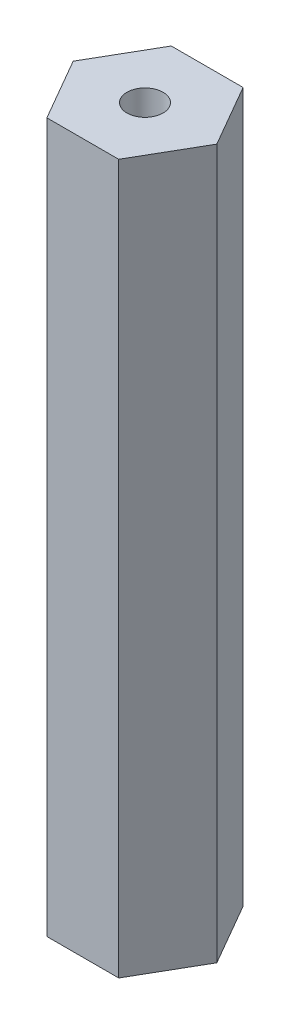
ISO-10303-21;
HEADER;
FILE_DESCRIPTION(('STEP AP214'),'2;1');
FILE_NAME('part.step','',(''),(''),'','','');
FILE_SCHEMA(('AUTOMOTIVE_DESIGN { 1 0 10303 214 1 1 1 1 }'));
ENDSEC;
DATA;
#1=APPLICATION_CONTEXT('core data for automotive mechanical design processes');
#2=APPLICATION_PROTOCOL_DEFINITION('international standard','automotive_design',2000,#1);
#3=PRODUCT_CONTEXT('',#1,'mechanical');
#4=PRODUCT('Part','Part','',(#3));
#5=PRODUCT_RELATED_PRODUCT_CATEGORY('part','',(#4));
#6=PRODUCT_DEFINITION_FORMATION('','',#4);
#7=PRODUCT_DEFINITION_CONTEXT('part definition',#1,'design');
#8=PRODUCT_DEFINITION('design','',#6,#7);
#9=PRODUCT_DEFINITION_SHAPE('','',#8);
#10=(LENGTH_UNIT() NAMED_UNIT(*) SI_UNIT(.MILLI.,.METRE.));
#11=(NAMED_UNIT(*) PLANE_ANGLE_UNIT() SI_UNIT($,.RADIAN.));
#12=(NAMED_UNIT(*) SI_UNIT($,.STERADIAN.) SOLID_ANGLE_UNIT());
#13=UNCERTAINTY_MEASURE_WITH_UNIT(LENGTH_MEASURE(1.E-05),#10,'distance_accuracy_value','');
#14=(GEOMETRIC_REPRESENTATION_CONTEXT(3) GLOBAL_UNCERTAINTY_ASSIGNED_CONTEXT((#13)) GLOBAL_UNIT_ASSIGNED_CONTEXT((#10,
#11,#12)) REPRESENTATION_CONTEXT('',''));
#15=CARTESIAN_POINT('',(0.,0.,0.));
#16=DIRECTION('',(0.,0.,1.));
#17=DIRECTION('',(1.,0.,0.));
#18=AXIS2_PLACEMENT_3D('',#15,#16,#17);
#19=CARTESIAN_POINT('',(0.,57.,0.));
#20=DIRECTION('',(0.,1.,0.));
#21=DIRECTION('',(0.,0.,1.));
#22=AXIS2_PLACEMENT_3D('',#19,#20,#21);
#23=PLANE('',#22);
#24=DIRECTION('',(0.5,0.,-0.866025403784439));
#25=VECTOR('',#24,1.);
#26=CARTESIAN_POINT('',(2.88675134594813,57.,5.));
#27=LINE('',#26,#25);
#28=CARTESIAN_POINT('',(2.88675134594813,57.,5.));
#29=VERTEX_POINT('',#28);
#30=CARTESIAN_POINT('',(5.77350269189626,57.,0.));
#31=VERTEX_POINT('',#30);
#32=EDGE_CURVE('E131',#29,#31,#27,.T.);
#33=ORIENTED_EDGE('',*,*,#32,.T.);
#34=DIRECTION('',(-0.500000000000001,0.,-0.866025403784438));
#35=VECTOR('',#34,1.);
#36=CARTESIAN_POINT('',(5.77350269189626,57.,0.));
#37=LINE('',#36,#35);
#38=CARTESIAN_POINT('',(2.88675134594813,57.,-5.));
#39=VERTEX_POINT('',#38);
#40=EDGE_CURVE('E89',#31,#39,#37,.T.);
#41=ORIENTED_EDGE('',*,*,#40,.T.);
#42=DIRECTION('',(-1.,0.,0.));
#43=VECTOR('',#42,1.);
#44=CARTESIAN_POINT('',(2.88675134594813,57.,-5.));
#45=LINE('',#44,#43);
#46=CARTESIAN_POINT('',(-2.88675134594813,57.,-5.));
#47=VERTEX_POINT('',#46);
#48=EDGE_CURVE('E102',#39,#47,#45,.T.);
#49=ORIENTED_EDGE('',*,*,#48,.T.);
#50=DIRECTION('',(-0.5,0.,0.866025403784439));
#51=VECTOR('',#50,1.);
#52=CARTESIAN_POINT('',(-2.88675134594813,57.,-5.));
#53=LINE('',#52,#51);
#54=CARTESIAN_POINT('',(-5.77350269189626,57.,0.));
#55=VERTEX_POINT('',#54);
#56=EDGE_CURVE('E96',#47,#55,#53,.T.);
#57=ORIENTED_EDGE('',*,*,#56,.T.);
#58=DIRECTION('',(0.5,0.,0.866025403784439));
#59=VECTOR('',#58,1.);
#60=CARTESIAN_POINT('',(-5.77350269189626,57.,0.));
#61=LINE('',#60,#59);
#62=CARTESIAN_POINT('',(-2.88675134594813,57.,5.));
#63=VERTEX_POINT('',#62);
#64=EDGE_CURVE('E100',#55,#63,#61,.T.);
#65=ORIENTED_EDGE('',*,*,#64,.T.);
#66=DIRECTION('',(1.,0.,0.));
#67=VECTOR('',#66,1.);
#68=CARTESIAN_POINT('',(-2.88675134594813,57.,5.));
#69=LINE('',#68,#67);
#70=EDGE_CURVE('E52',#63,#29,#69,.T.);
#71=ORIENTED_EDGE('',*,*,#70,.T.);
#72=EDGE_LOOP('',(#33,#41,#49,#57,#65,#71));
#73=FACE_BOUND('',#72,.T.);
#74=CARTESIAN_POINT('',(0.,57.,0.));
#75=DIRECTION('',(0.,1.,0.));
#76=DIRECTION('',(0.,0.,1.));
#77=AXIS2_PLACEMENT_3D('',#74,#75,#76);
#78=CIRCLE('',#77,1.45);
#79=CARTESIAN_POINT('',(0.,57.,-1.45));
#80=VERTEX_POINT('',#79);
#81=EDGE_CURVE('E124',#80,#80,#78,.T.);
#82=ORIENTED_EDGE('',*,*,#81,.F.);
#83=EDGE_LOOP('',(#82));
#84=FACE_BOUND('',#83,.T.);
#85=ADVANCED_FACE('F35',(#73,#84),#23,.T.);
#86=CARTESIAN_POINT('',(0.,0.,0.));
#87=DIRECTION('',(0.,1.,0.));
#88=DIRECTION('',(0.,0.,1.));
#89=AXIS2_PLACEMENT_3D('',#86,#87,#88);
#90=PLANE('',#89);
#91=DIRECTION('',(0.5,0.,-0.866025403784439));
#92=VECTOR('',#91,1.);
#93=CARTESIAN_POINT('',(2.88675134594813,0.,5.));
#94=LINE('',#93,#92);
#95=CARTESIAN_POINT('',(2.88675134594813,0.,5.));
#96=VERTEX_POINT('',#95);
#97=CARTESIAN_POINT('',(5.77350269189626,0.,0.));
#98=VERTEX_POINT('',#97);
#99=EDGE_CURVE('E120',#96,#98,#94,.T.);
#100=ORIENTED_EDGE('',*,*,#99,.F.);
#101=DIRECTION('',(1.,0.,0.));
#102=VECTOR('',#101,1.);
#103=CARTESIAN_POINT('',(-2.88675134594813,0.,5.));
#104=LINE('',#103,#102);
#105=CARTESIAN_POINT('',(-2.88675134594813,0.,5.));
#106=VERTEX_POINT('',#105);
#107=EDGE_CURVE('E81',#106,#96,#104,.T.);
#108=ORIENTED_EDGE('',*,*,#107,.F.);
#109=DIRECTION('',(0.5,0.,0.866025403784439));
#110=VECTOR('',#109,1.);
#111=CARTESIAN_POINT('',(-5.77350269189626,0.,0.));
#112=LINE('',#111,#110);
#113=CARTESIAN_POINT('',(-5.77350269189626,0.,0.));
#114=VERTEX_POINT('',#113);
#115=EDGE_CURVE('E75',#114,#106,#112,.T.);
#116=ORIENTED_EDGE('',*,*,#115,.F.);
#117=DIRECTION('',(-0.5,0.,0.866025403784439));
#118=VECTOR('',#117,1.);
#119=CARTESIAN_POINT('',(-2.88675134594813,0.,-5.));
#120=LINE('',#119,#118);
#121=CARTESIAN_POINT('',(-2.88675134594813,0.,-5.));
#122=VERTEX_POINT('',#121);
#123=EDGE_CURVE('E110',#122,#114,#120,.T.);
#124=ORIENTED_EDGE('',*,*,#123,.F.);
#125=DIRECTION('',(-1.,0.,0.));
#126=VECTOR('',#125,1.);
#127=CARTESIAN_POINT('',(2.88675134594813,0.,-5.));
#128=LINE('',#127,#126);
#129=CARTESIAN_POINT('',(2.88675134594813,0.,-5.));
#130=VERTEX_POINT('',#129);
#131=EDGE_CURVE('E126',#130,#122,#128,.T.);
#132=ORIENTED_EDGE('',*,*,#131,.F.);
#133=DIRECTION('',(-0.500000000000001,0.,-0.866025403784438));
#134=VECTOR('',#133,1.);
#135=CARTESIAN_POINT('',(5.77350269189626,0.,0.));
#136=LINE('',#135,#134);
#137=EDGE_CURVE('E123',#98,#130,#136,.T.);
#138=ORIENTED_EDGE('',*,*,#137,.F.);
#139=EDGE_LOOP('',(#100,#108,#116,#124,#132,#138));
#140=FACE_BOUND('',#139,.T.);
#141=CARTESIAN_POINT('',(0.,0.,0.));
#142=DIRECTION('',(0.,1.,0.));
#143=DIRECTION('',(0.,0.,1.));
#144=AXIS2_PLACEMENT_3D('',#141,#142,#143);
#145=CIRCLE('',#144,1.45);
#146=CARTESIAN_POINT('',(0.,0.,-1.45));
#147=VERTEX_POINT('',#146);
#148=EDGE_CURVE('E224',#147,#147,#145,.T.);
#149=ORIENTED_EDGE('',*,*,#148,.T.);
#150=EDGE_LOOP('',(#149));
#151=FACE_BOUND('',#150,.T.);
#152=ADVANCED_FACE('F140',(#140,#151),#90,.F.);
#153=CARTESIAN_POINT('',(2.88675134594813,57.,5.));
#154=DIRECTION('',(-0.866025403784439,0.,-0.5));
#155=DIRECTION('',(-0.5,0.,0.866025403784439));
#156=AXIS2_PLACEMENT_3D('',#153,#154,#155);
#157=PLANE('',#156);
#158=ORIENTED_EDGE('',*,*,#99,.T.);
#159=DIRECTION('',(0.,-1.,0.));
#160=VECTOR('',#159,1.);
#161=CARTESIAN_POINT('',(5.77350269189626,57.,0.));
#162=LINE('',#161,#160);
#163=EDGE_CURVE('E11',#31,#98,#162,.T.);
#164=ORIENTED_EDGE('',*,*,#163,.F.);
#165=ORIENTED_EDGE('',*,*,#32,.F.);
#166=DIRECTION('',(0.,-1.,0.));
#167=VECTOR('',#166,1.);
#168=CARTESIAN_POINT('',(2.88675134594813,57.,5.));
#169=LINE('',#168,#167);
#170=EDGE_CURVE('E116',#29,#96,#169,.T.);
#171=ORIENTED_EDGE('',*,*,#170,.T.);
#172=EDGE_LOOP('',(#158,#164,#165,#171));
#173=FACE_BOUND('',#172,.T.);
#174=ADVANCED_FACE('F37',(#173),#157,.F.);
#175=CARTESIAN_POINT('',(5.77350269189626,57.,0.));
#176=DIRECTION('',(-0.866025403784438,0.,0.5));
#177=DIRECTION('',(0.500000000000001,0.,0.866025403784438));
#178=AXIS2_PLACEMENT_3D('',#175,#176,#177);
#179=PLANE('',#178);
#180=ORIENTED_EDGE('',*,*,#137,.T.);
#181=DIRECTION('',(0.,-1.,0.));
#182=VECTOR('',#181,1.);
#183=CARTESIAN_POINT('',(2.88675134594813,57.,-5.));
#184=LINE('',#183,#182);
#185=EDGE_CURVE('E44',#39,#130,#184,.T.);
#186=ORIENTED_EDGE('',*,*,#185,.F.);
#187=ORIENTED_EDGE('',*,*,#40,.F.);
#188=ORIENTED_EDGE('',*,*,#163,.T.);
#189=EDGE_LOOP('',(#180,#186,#187,#188));
#190=FACE_BOUND('',#189,.T.);
#191=ADVANCED_FACE('F165',(#190),#179,.F.);
#192=CARTESIAN_POINT('',(2.88675134594813,57.,-5.));
#193=DIRECTION('',(0.,0.,1.));
#194=DIRECTION('',(1.,0.,0.));
#195=AXIS2_PLACEMENT_3D('',#192,#193,#194);
#196=PLANE('',#195);
#197=ORIENTED_EDGE('',*,*,#131,.T.);
#198=DIRECTION('',(0.,-1.,0.));
#199=VECTOR('',#198,1.);
#200=CARTESIAN_POINT('',(-2.88675134594813,57.,-5.));
#201=LINE('',#200,#199);
#202=EDGE_CURVE('E111',#47,#122,#201,.T.);
#203=ORIENTED_EDGE('',*,*,#202,.F.);
#204=ORIENTED_EDGE('',*,*,#48,.F.);
#205=ORIENTED_EDGE('',*,*,#185,.T.);
#206=EDGE_LOOP('',(#197,#203,#204,#205));
#207=FACE_BOUND('',#206,.T.);
#208=ADVANCED_FACE('F137',(#207),#196,.F.);
#209=CARTESIAN_POINT('',(-2.88675134594813,57.,-5.));
#210=DIRECTION('',(0.866025403784439,0.,0.5));
#211=DIRECTION('',(0.5,0.,-0.866025403784439));
#212=AXIS2_PLACEMENT_3D('',#209,#210,#211);
#213=PLANE('',#212);
#214=ORIENTED_EDGE('',*,*,#123,.T.);
#215=DIRECTION('',(0.,-1.,0.));
#216=VECTOR('',#215,1.);
#217=CARTESIAN_POINT('',(-5.77350269189626,57.,0.));
#218=LINE('',#217,#216);
#219=EDGE_CURVE('E107',#55,#114,#218,.T.);
#220=ORIENTED_EDGE('',*,*,#219,.F.);
#221=ORIENTED_EDGE('',*,*,#56,.F.);
#222=ORIENTED_EDGE('',*,*,#202,.T.);
#223=EDGE_LOOP('',(#214,#220,#221,#222));
#224=FACE_BOUND('',#223,.T.);
#225=ADVANCED_FACE('F108',(#224),#213,.F.);
#226=CARTESIAN_POINT('',(-5.77350269189626,57.,0.));
#227=DIRECTION('',(0.866025403784439,0.,-0.5));
#228=DIRECTION('',(-0.5,0.,-0.866025403784439));
#229=AXIS2_PLACEMENT_3D('',#226,#227,#228);
#230=PLANE('',#229);
#231=ORIENTED_EDGE('',*,*,#115,.T.);
#232=DIRECTION('',(0.,-1.,0.));
#233=VECTOR('',#232,1.);
#234=CARTESIAN_POINT('',(-2.88675134594813,57.,5.));
#235=LINE('',#234,#233);
#236=EDGE_CURVE('E112',#63,#106,#235,.T.);
#237=ORIENTED_EDGE('',*,*,#236,.F.);
#238=ORIENTED_EDGE('',*,*,#64,.F.);
#239=ORIENTED_EDGE('',*,*,#219,.T.);
#240=EDGE_LOOP('',(#231,#237,#238,#239));
#241=FACE_BOUND('',#240,.T.);
#242=ADVANCED_FACE('F114',(#241),#230,.F.);
#243=CARTESIAN_POINT('',(-2.88675134594813,57.,5.));
#244=DIRECTION('',(0.,0.,-1.));
#245=DIRECTION('',(-1.,0.,0.));
#246=AXIS2_PLACEMENT_3D('',#243,#244,#245);
#247=PLANE('',#246);
#248=ORIENTED_EDGE('',*,*,#107,.T.);
#249=ORIENTED_EDGE('',*,*,#170,.F.);
#250=ORIENTED_EDGE('',*,*,#70,.F.);
#251=ORIENTED_EDGE('',*,*,#236,.T.);
#252=EDGE_LOOP('',(#248,#249,#250,#251));
#253=FACE_BOUND('',#252,.T.);
#254=ADVANCED_FACE('F145',(#253),#247,.F.);
#255=CARTESIAN_POINT('',(0.,57.,0.));
#256=DIRECTION('',(0.,-1.,0.));
#257=DIRECTION('',(0.,0.,-1.));
#258=AXIS2_PLACEMENT_3D('',#255,#256,#257);
#259=CYLINDRICAL_SURFACE('',#258,1.45);
#260=CARTESIAN_POINT('',(0.,57.,-1.45));
#261=CARTESIAN_POINT('',(0.,56.40625,-1.45));
#262=CARTESIAN_POINT('',(0.,55.8125,-1.45));
#263=CARTESIAN_POINT('',(0.,54.625,-1.45));
#264=CARTESIAN_POINT('',(0.,54.03125,-1.45));
#265=CARTESIAN_POINT('',(0.,52.84375,-1.45));
#266=CARTESIAN_POINT('',(0.,52.25,-1.45));
#267=CARTESIAN_POINT('',(0.,51.0625,-1.45));
#268=CARTESIAN_POINT('',(0.,50.46875,-1.45));
#269=CARTESIAN_POINT('',(0.,49.28125,-1.45));
#270=CARTESIAN_POINT('',(0.,48.6875,-1.45));
#271=CARTESIAN_POINT('',(0.,47.5,-1.45));
#272=CARTESIAN_POINT('',(0.,46.90625,-1.45));
#273=CARTESIAN_POINT('',(0.,45.71875,-1.45));
#274=CARTESIAN_POINT('',(0.,45.125,-1.45));
#275=CARTESIAN_POINT('',(0.,43.9375,-1.45));
#276=CARTESIAN_POINT('',(0.,43.34375,-1.45));
#277=CARTESIAN_POINT('',(0.,42.15625,-1.45));
#278=CARTESIAN_POINT('',(0.,41.5625,-1.45));
#279=CARTESIAN_POINT('',(0.,40.375,-1.45));
#280=CARTESIAN_POINT('',(0.,39.78125,-1.45));
#281=CARTESIAN_POINT('',(0.,38.59375,-1.45));
#282=CARTESIAN_POINT('',(0.,38.,-1.45));
#283=CARTESIAN_POINT('',(0.,36.8125,-1.45));
#284=CARTESIAN_POINT('',(0.,36.21875,-1.45));
#285=CARTESIAN_POINT('',(0.,35.03125,-1.45));
#286=CARTESIAN_POINT('',(0.,34.4375,-1.45));
#287=CARTESIAN_POINT('',(0.,33.25,-1.45));
#288=CARTESIAN_POINT('',(0.,32.65625,-1.45));
#289=CARTESIAN_POINT('',(0.,31.46875,-1.45));
#290=CARTESIAN_POINT('',(0.,30.875,-1.45));
#291=CARTESIAN_POINT('',(0.,29.6875,-1.45));
#292=CARTESIAN_POINT('',(0.,29.09375,-1.45));
#293=CARTESIAN_POINT('',(0.,27.90625,-1.45));
#294=CARTESIAN_POINT('',(0.,27.3125,-1.45));
#295=CARTESIAN_POINT('',(0.,26.125,-1.45));
#296=CARTESIAN_POINT('',(0.,25.53125,-1.45));
#297=CARTESIAN_POINT('',(0.,24.34375,-1.45));
#298=CARTESIAN_POINT('',(0.,23.75,-1.45));
#299=CARTESIAN_POINT('',(0.,22.5625,-1.45));
#300=CARTESIAN_POINT('',(0.,21.96875,-1.45));
#301=CARTESIAN_POINT('',(0.,20.78125,-1.45));
#302=CARTESIAN_POINT('',(0.,20.1875,-1.45));
#303=CARTESIAN_POINT('',(0.,19.,-1.45));
#304=CARTESIAN_POINT('',(0.,18.40625,-1.45));
#305=CARTESIAN_POINT('',(0.,17.21875,-1.45));
#306=CARTESIAN_POINT('',(0.,16.625,-1.45));
#307=CARTESIAN_POINT('',(0.,15.4375,-1.45));
#308=CARTESIAN_POINT('',(0.,14.84375,-1.45));
#309=CARTESIAN_POINT('',(0.,13.65625,-1.45));
#310=CARTESIAN_POINT('',(0.,13.0625,-1.45));
#311=CARTESIAN_POINT('',(0.,11.875,-1.45));
#312=CARTESIAN_POINT('',(0.,11.28125,-1.45));
#313=CARTESIAN_POINT('',(0.,10.09375,-1.45));
#314=CARTESIAN_POINT('',(0.,9.5,-1.45));
#315=CARTESIAN_POINT('',(0.,8.3125,-1.45));
#316=CARTESIAN_POINT('',(0.,7.71875,-1.45));
#317=CARTESIAN_POINT('',(0.,6.53125,-1.45));
#318=CARTESIAN_POINT('',(0.,5.9375,-1.45));
#319=CARTESIAN_POINT('',(0.,4.75,-1.45));
#320=CARTESIAN_POINT('',(0.,4.15625,-1.45));
#321=CARTESIAN_POINT('',(0.,2.96875,-1.45));
#322=CARTESIAN_POINT('',(0.,2.375,-1.45));
#323=CARTESIAN_POINT('',(0.,1.1875,-1.45));
#324=CARTESIAN_POINT('',(0.,0.593749999999999,-1.45));
#325=CARTESIAN_POINT('',(0.,0.,-1.45));
#326=B_SPLINE_CURVE_WITH_KNOTS('',3,(#260,#261,#262,#263,#264,#265,#266,#267,#268,#269,#270,
#271,#272,#273,#274,#275,#276,#277,#278,#279,#280,#281,#282,#283,#284,#285,#286,#287,#288,#289,
#290,#291,#292,#293,#294,#295,#296,#297,#298,#299,#300,#301,#302,#303,#304,#305,#306,#307,#308,
#309,#310,#311,#312,#313,#314,#315,#316,#317,#318,#319,#320,#321,#322,#323,#324,#325),
.UNSPECIFIED.,.F.,.F.,(4,2,2,2,2,2,2,2,2,2,2,2,2,2,2,2,2,2,2,2,2,2,2,2,2,2,2,2,2,2,2,2,4),(0.,
1.78125,3.5625,5.34374999999999,7.12499999999999,8.90625,10.6875,12.46875,14.25,16.03125,
17.8125,19.59375,21.375,23.15625,24.9375,26.71875,28.5,30.28125,32.0625,33.84375,35.625,
37.40625,39.1875,40.96875,42.75,44.53125,46.3125,48.09375,49.875,51.65625,53.4375,55.21875,57.),.UNSPECIFIED.);
#327=EDGE_CURVE('BSEAM147',#80,#147,#326,.T.);
#328=ORIENTED_EDGE('',*,*,#81,.T.);
#329=ORIENTED_EDGE('',*,*,#148,.F.);
#330=ORIENTED_EDGE('',*,*,#327,.T.);
#331=ORIENTED_EDGE('',*,*,#327,.F.);
#332=EDGE_LOOP('',(#328,#330,#329,#331));
#333=FACE_BOUND('',#332,.T.);
#334=ADVANCED_FACE('F147',(#333),#259,.F.);
#335=CLOSED_SHELL('',(#85,#152,#174,#191,#208,#225,#242,#254,#334));
#336=MANIFOLD_SOLID_BREP('B2',#335);
#337=ADVANCED_BREP_SHAPE_REPRESENTATION('',(#18,#336),#14);
#338=SHAPE_DEFINITION_REPRESENTATION(#9,#337);
ENDSEC;
END-ISO-10303-21;
